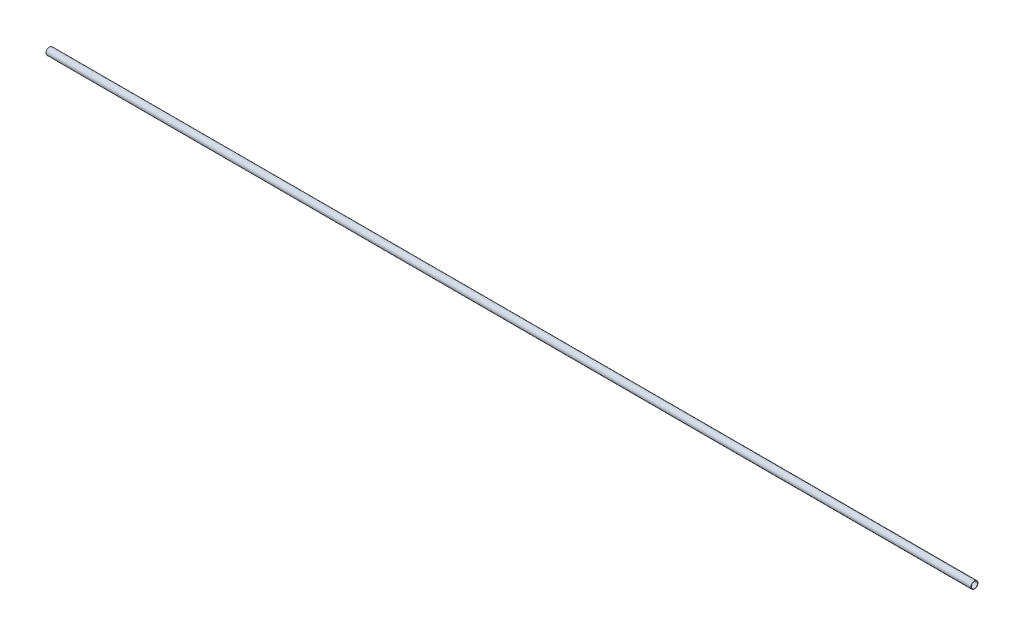
ISO-10303-21;
HEADER;
FILE_DESCRIPTION(('STEP AP214'),'2;1');
FILE_NAME('part.step','',(''),(''),'','','');
FILE_SCHEMA(('AUTOMOTIVE_DESIGN { 1 0 10303 214 1 1 1 1 }'));
ENDSEC;
DATA;
#1=APPLICATION_CONTEXT('core data for automotive mechanical design processes');
#2=APPLICATION_PROTOCOL_DEFINITION('international standard','automotive_design',2000,#1);
#3=PRODUCT_CONTEXT('',#1,'mechanical');
#4=PRODUCT('Part','Part','',(#3));
#5=PRODUCT_RELATED_PRODUCT_CATEGORY('part','',(#4));
#6=PRODUCT_DEFINITION_FORMATION('','',#4);
#7=PRODUCT_DEFINITION_CONTEXT('part definition',#1,'design');
#8=PRODUCT_DEFINITION('design','',#6,#7);
#9=PRODUCT_DEFINITION_SHAPE('','',#8);
#10=(LENGTH_UNIT() NAMED_UNIT(*) SI_UNIT(.MILLI.,.METRE.));
#11=(NAMED_UNIT(*) PLANE_ANGLE_UNIT() SI_UNIT($,.RADIAN.));
#12=(NAMED_UNIT(*) SI_UNIT($,.STERADIAN.) SOLID_ANGLE_UNIT());
#13=UNCERTAINTY_MEASURE_WITH_UNIT(LENGTH_MEASURE(1.E-05),#10,'distance_accuracy_value','');
#14=(GEOMETRIC_REPRESENTATION_CONTEXT(3) GLOBAL_UNCERTAINTY_ASSIGNED_CONTEXT((#13)) GLOBAL_UNIT_ASSIGNED_CONTEXT((#10,
#11,#12)) REPRESENTATION_CONTEXT('',''));
#15=CARTESIAN_POINT('',(0.,0.,0.));
#16=DIRECTION('',(0.,0.,1.));
#17=DIRECTION('',(1.,0.,0.));
#18=AXIS2_PLACEMENT_3D('',#15,#16,#17);
#19=CARTESIAN_POINT('',(3048.,0.,0.));
#20=DIRECTION('',(1.,0.,0.));
#21=DIRECTION('',(0.,0.,-1.));
#22=AXIS2_PLACEMENT_3D('',#19,#20,#21);
#23=PLANE('',#22);
#24=CARTESIAN_POINT('',(3048.,0.,0.));
#25=DIRECTION('',(1.,0.,0.));
#26=DIRECTION('',(0.,0.,-1.));
#27=AXIS2_PLACEMENT_3D('',#24,#25,#26);
#28=CIRCLE('',#27,11.7094);
#29=CARTESIAN_POINT('',(3048.,0.,-11.7094));
#30=VERTEX_POINT('',#29);
#31=EDGE_CURVE('E10',#30,#30,#28,.T.);
#32=ORIENTED_EDGE('',*,*,#31,.T.);
#33=EDGE_LOOP('',(#32));
#34=FACE_BOUND('',#33,.T.);
#35=CARTESIAN_POINT('',(3048.,0.,0.));
#36=DIRECTION('',(1.,0.,0.));
#37=DIRECTION('',(0.,0.,-1.));
#38=AXIS2_PLACEMENT_3D('',#35,#36,#37);
#39=CIRCLE('',#38,10.4648);
#40=CARTESIAN_POINT('',(3048.,0.,-10.4648));
#41=VERTEX_POINT('',#40);
#42=EDGE_CURVE('E42',#41,#41,#39,.T.);
#43=ORIENTED_EDGE('',*,*,#42,.F.);
#44=EDGE_LOOP('',(#43));
#45=FACE_BOUND('',#44,.T.);
#46=ADVANCED_FACE('F31',(#34,#45),#23,.T.);
#47=CARTESIAN_POINT('',(0.,0.,0.));
#48=DIRECTION('',(1.,0.,0.));
#49=DIRECTION('',(0.,0.,-1.));
#50=AXIS2_PLACEMENT_3D('',#47,#48,#49);
#51=PLANE('',#50);
#52=CARTESIAN_POINT('',(0.,0.,0.));
#53=DIRECTION('',(1.,0.,0.));
#54=DIRECTION('',(0.,0.,-1.));
#55=AXIS2_PLACEMENT_3D('',#52,#53,#54);
#56=CIRCLE('',#55,11.7094);
#57=CARTESIAN_POINT('',(0.,0.,-11.7094));
#58=VERTEX_POINT('',#57);
#59=EDGE_CURVE('E35',#58,#58,#56,.T.);
#60=ORIENTED_EDGE('',*,*,#59,.F.);
#61=EDGE_LOOP('',(#60));
#62=FACE_BOUND('',#61,.T.);
#63=CARTESIAN_POINT('',(0.,0.,0.));
#64=DIRECTION('',(1.,0.,0.));
#65=DIRECTION('',(0.,0.,-1.));
#66=AXIS2_PLACEMENT_3D('',#63,#64,#65);
#67=CIRCLE('',#66,10.4648);
#68=CARTESIAN_POINT('',(0.,0.,-10.4648));
#69=VERTEX_POINT('',#68);
#70=EDGE_CURVE('E44',#69,#69,#67,.T.);
#71=ORIENTED_EDGE('',*,*,#70,.T.);
#72=EDGE_LOOP('',(#71));
#73=FACE_BOUND('',#72,.T.);
#74=ADVANCED_FACE('F54',(#62,#73),#51,.F.);
#75=CARTESIAN_POINT('',(3048.,0.,0.));
#76=DIRECTION('',(-1.,0.,0.));
#77=DIRECTION('',(0.,0.,1.));
#78=AXIS2_PLACEMENT_3D('',#75,#76,#77);
#79=CYLINDRICAL_SURFACE('',#78,11.7094);
#80=ORIENTED_EDGE('',*,*,#31,.F.);
#81=EDGE_LOOP('',(#80));
#82=FACE_BOUND('',#81,.T.);
#83=ORIENTED_EDGE('',*,*,#59,.T.);
#84=EDGE_LOOP('',(#83));
#85=FACE_BOUND('',#84,.T.);
#86=ADVANCED_FACE('F33',(#82,#85),#79,.T.);
#87=CARTESIAN_POINT('',(3048.,0.,0.));
#88=DIRECTION('',(-1.,0.,0.));
#89=DIRECTION('',(0.,0.,1.));
#90=AXIS2_PLACEMENT_3D('',#87,#88,#89);
#91=CYLINDRICAL_SURFACE('',#90,10.4648);
#92=ORIENTED_EDGE('',*,*,#42,.T.);
#93=EDGE_LOOP('',(#92));
#94=FACE_BOUND('',#93,.T.);
#95=ORIENTED_EDGE('',*,*,#70,.F.);
#96=EDGE_LOOP('',(#95));
#97=FACE_BOUND('',#96,.T.);
#98=ADVANCED_FACE('F50',(#94,#97),#91,.F.);
#99=CLOSED_SHELL('',(#46,#74,#86,#98));
#100=MANIFOLD_SOLID_BREP('B2',#99);
#101=ADVANCED_BREP_SHAPE_REPRESENTATION('',(#18,#100),#14);
#102=SHAPE_DEFINITION_REPRESENTATION(#9,#101);
ENDSEC;
END-ISO-10303-21;
